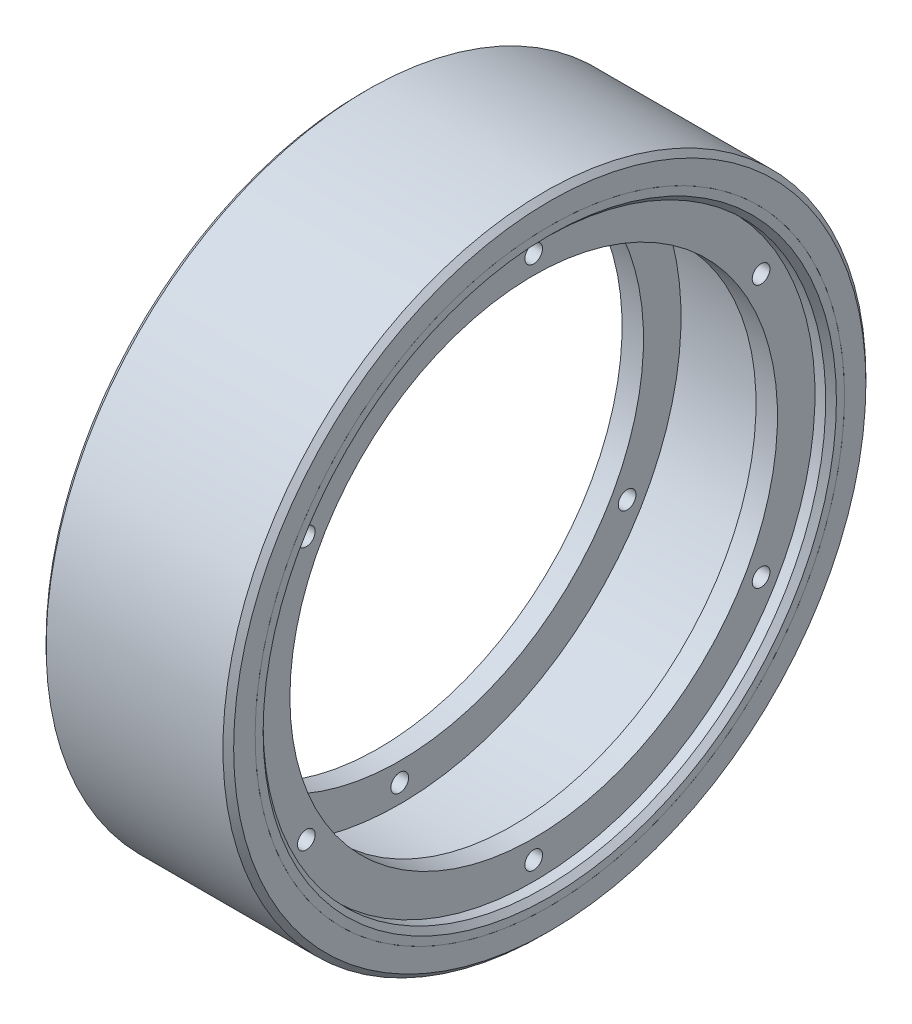
ISO-10303-21;
HEADER;
FILE_DESCRIPTION(('STEP AP214'),'2;1');
FILE_NAME('part.step','',(''),(''),'','','');
FILE_SCHEMA(('AUTOMOTIVE_DESIGN { 1 0 10303 214 1 1 1 1 }'));
ENDSEC;
DATA;
#1=APPLICATION_CONTEXT('core data for automotive mechanical design processes');
#2=APPLICATION_PROTOCOL_DEFINITION('international standard','automotive_design',2000,#1);
#3=PRODUCT_CONTEXT('',#1,'mechanical');
#4=PRODUCT('Part','Part','',(#3));
#5=PRODUCT_RELATED_PRODUCT_CATEGORY('part','',(#4));
#6=PRODUCT_DEFINITION_FORMATION('','',#4);
#7=PRODUCT_DEFINITION_CONTEXT('part definition',#1,'design');
#8=PRODUCT_DEFINITION('design','',#6,#7);
#9=PRODUCT_DEFINITION_SHAPE('','',#8);
#10=(LENGTH_UNIT() NAMED_UNIT(*) SI_UNIT(.MILLI.,.METRE.));
#11=(NAMED_UNIT(*) PLANE_ANGLE_UNIT() SI_UNIT($,.RADIAN.));
#12=(NAMED_UNIT(*) SI_UNIT($,.STERADIAN.) SOLID_ANGLE_UNIT());
#13=UNCERTAINTY_MEASURE_WITH_UNIT(LENGTH_MEASURE(1.E-05),#10,'distance_accuracy_value','');
#14=(GEOMETRIC_REPRESENTATION_CONTEXT(3) GLOBAL_UNCERTAINTY_ASSIGNED_CONTEXT((#13)) GLOBAL_UNIT_ASSIGNED_CONTEXT((#10,
#11,#12)) REPRESENTATION_CONTEXT('',''));
#15=CARTESIAN_POINT('',(0.,0.,0.));
#16=DIRECTION('',(0.,0.,1.));
#17=DIRECTION('',(1.,0.,0.));
#18=AXIS2_PLACEMENT_3D('',#15,#16,#17);
#19=CARTESIAN_POINT('',(17.5,52.5,0.));
#20=DIRECTION('',(-1.,0.,0.));
#21=DIRECTION('',(0.,0.,1.));
#22=AXIS2_PLACEMENT_3D('',#19,#20,#21);
#23=PLANE('',#22);
#24=CARTESIAN_POINT('',(17.5,0.,0.));
#25=DIRECTION('',(-1.,0.,0.));
#26=DIRECTION('',(0.,0.,1.));
#27=AXIS2_PLACEMENT_3D('',#24,#25,#26);
#28=CIRCLE('',#27,53.5);
#29=CARTESIAN_POINT('',(17.5,0.,53.5));
#30=VERTEX_POINT('',#29);
#31=EDGE_CURVE('E63',#30,#30,#28,.T.);
#32=ORIENTED_EDGE('',*,*,#31,.T.);
#33=EDGE_LOOP('',(#32));
#34=FACE_BOUND('',#33,.T.);
#35=CARTESIAN_POINT('',(17.5,0.,0.));
#36=DIRECTION('',(-1.,0.,0.));
#37=DIRECTION('',(0.,0.,1.));
#38=AXIS2_PLACEMENT_3D('',#35,#36,#37);
#39=CIRCLE('',#38,55.);
#40=CARTESIAN_POINT('',(17.5,0.,55.));
#41=VERTEX_POINT('',#40);
#42=EDGE_CURVE('E68',#41,#41,#39,.T.);
#43=ORIENTED_EDGE('',*,*,#42,.F.);
#44=EDGE_LOOP('',(#43));
#45=FACE_BOUND('',#44,.T.);
#46=ADVANCED_FACE('F47',(#34,#45),#23,.F.);
#47=CARTESIAN_POINT('',(0.,0.,0.));
#48=DIRECTION('',(-1.,0.,0.));
#49=DIRECTION('',(0.,0.,1.));
#50=AXIS2_PLACEMENT_3D('',#47,#48,#49);
#51=CYLINDRICAL_SURFACE('',#50,55.);
#52=CARTESIAN_POINT('',(-17.5,0.,0.));
#53=DIRECTION('',(-1.,0.,0.));
#54=DIRECTION('',(0.,0.,1.));
#55=AXIS2_PLACEMENT_3D('',#52,#53,#54);
#56=CIRCLE('',#55,55.);
#57=CARTESIAN_POINT('',(-17.5,0.,55.));
#58=VERTEX_POINT('',#57);
#59=EDGE_CURVE('E101',#58,#58,#56,.T.);
#60=ORIENTED_EDGE('',*,*,#59,.F.);
#61=EDGE_LOOP('',(#60));
#62=FACE_BOUND('',#61,.T.);
#63=ORIENTED_EDGE('',*,*,#42,.T.);
#64=EDGE_LOOP('',(#63));
#65=FACE_BOUND('',#64,.T.);
#66=ADVANCED_FACE('F200',(#62,#65),#51,.T.);
#67=CARTESIAN_POINT('',(-17.5,55.,0.));
#68=DIRECTION('',(1.,0.,0.));
#69=DIRECTION('',(0.,0.,-1.));
#70=AXIS2_PLACEMENT_3D('',#67,#68,#69);
#71=PLANE('',#70);
#72=CARTESIAN_POINT('',(-17.5,0.,0.));
#73=DIRECTION('',(1.,0.,0.));
#74=DIRECTION('',(0.,0.,-1.));
#75=AXIS2_PLACEMENT_3D('',#72,#73,#74);
#76=CIRCLE('',#75,53.5);
#77=CARTESIAN_POINT('',(-17.5,0.,-53.5));
#78=VERTEX_POINT('',#77);
#79=EDGE_CURVE('E11',#78,#78,#76,.T.);
#80=ORIENTED_EDGE('',*,*,#79,.T.);
#81=EDGE_LOOP('',(#80));
#82=FACE_BOUND('',#81,.T.);
#83=ORIENTED_EDGE('',*,*,#59,.T.);
#84=EDGE_LOOP('',(#83));
#85=FACE_BOUND('',#84,.T.);
#86=ADVANCED_FACE('F195',(#82,#85),#71,.F.);
#87=CARTESIAN_POINT('',(0.,0.,0.));
#88=DIRECTION('',(-1.,0.,0.));
#89=DIRECTION('',(0.,0.,1.));
#90=AXIS2_PLACEMENT_3D('',#87,#88,#89);
#91=CYLINDRICAL_SURFACE('',#90,52.5);
#92=CARTESIAN_POINT('',(-16.5,0.,0.));
#93=DIRECTION('',(1.,0.,0.));
#94=DIRECTION('',(0.,0.,-1.));
#95=AXIS2_PLACEMENT_3D('',#92,#93,#94);
#96=CIRCLE('',#95,52.5);
#97=CARTESIAN_POINT('',(-16.5,0.,-52.5));
#98=VERTEX_POINT('',#97);
#99=EDGE_CURVE('E55',#98,#98,#96,.F.);
#100=ORIENTED_EDGE('',*,*,#99,.T.);
#101=EDGE_LOOP('',(#100));
#102=FACE_BOUND('',#101,.T.);
#103=CARTESIAN_POINT('',(-14.5,0.,0.));
#104=DIRECTION('',(-1.,0.,0.));
#105=DIRECTION('',(0.,0.,1.));
#106=AXIS2_PLACEMENT_3D('',#103,#104,#105);
#107=CIRCLE('',#106,52.5);
#108=CARTESIAN_POINT('',(-14.5,0.,52.5));
#109=VERTEX_POINT('',#108);
#110=EDGE_CURVE('E104',#109,#109,#107,.T.);
#111=ORIENTED_EDGE('',*,*,#110,.F.);
#112=EDGE_LOOP('',(#111));
#113=FACE_BOUND('',#112,.T.);
#114=ADVANCED_FACE('F178',(#102,#113),#91,.F.);
#115=CARTESIAN_POINT('',(-14.5,52.5,0.));
#116=DIRECTION('',(1.,0.,0.));
#117=DIRECTION('',(0.,0.,-1.));
#118=AXIS2_PLACEMENT_3D('',#115,#116,#117);
#119=PLANE('',#118);
#120=CARTESIAN_POINT('',(-14.5,49.,0.));
#121=DIRECTION('',(-1.,0.,0.));
#122=DIRECTION('',(0.,0.,1.));
#123=AXIS2_PLACEMENT_3D('',#120,#121,#122);
#124=CIRCLE('',#123,1.64999999999999);
#125=CARTESIAN_POINT('',(-14.5,49.,1.64999999999999));
#126=VERTEX_POINT('',#125);
#127=EDGE_CURVE('E73',#126,#126,#124,.T.);
#128=ORIENTED_EDGE('',*,*,#127,.F.);
#129=EDGE_LOOP('',(#128));
#130=FACE_BOUND('',#129,.T.);
#131=CARTESIAN_POINT('',(-14.5,24.5,42.4352447854375));
#132=DIRECTION('',(-1.,0.,0.));
#133=DIRECTION('',(0.,0.,1.));
#134=AXIS2_PLACEMENT_3D('',#131,#132,#133);
#135=CIRCLE('',#134,1.64999999999999);
#136=CARTESIAN_POINT('',(-14.5,24.5,44.0852447854375));
#137=VERTEX_POINT('',#136);
#138=EDGE_CURVE('E78',#137,#137,#135,.T.);
#139=ORIENTED_EDGE('',*,*,#138,.F.);
#140=EDGE_LOOP('',(#139));
#141=FACE_BOUND('',#140,.T.);
#142=CARTESIAN_POINT('',(-14.5,-24.5,42.4352447854375));
#143=DIRECTION('',(-1.,0.,0.));
#144=DIRECTION('',(0.,0.,1.));
#145=AXIS2_PLACEMENT_3D('',#142,#143,#144);
#146=CIRCLE('',#145,1.64999999999999);
#147=CARTESIAN_POINT('',(-14.5,-24.5,44.0852447854375));
#148=VERTEX_POINT('',#147);
#149=EDGE_CURVE('E83',#148,#148,#146,.T.);
#150=ORIENTED_EDGE('',*,*,#149,.F.);
#151=EDGE_LOOP('',(#150));
#152=FACE_BOUND('',#151,.T.);
#153=CARTESIAN_POINT('',(-14.5,-49.,0.));
#154=DIRECTION('',(-1.,0.,0.));
#155=DIRECTION('',(0.,0.,1.));
#156=AXIS2_PLACEMENT_3D('',#153,#154,#155);
#157=CIRCLE('',#156,1.64999999999999);
#158=CARTESIAN_POINT('',(-14.5,-49.,1.65));
#159=VERTEX_POINT('',#158);
#160=EDGE_CURVE('E88',#159,#159,#157,.T.);
#161=ORIENTED_EDGE('',*,*,#160,.F.);
#162=EDGE_LOOP('',(#161));
#163=FACE_BOUND('',#162,.T.);
#164=CARTESIAN_POINT('',(-14.5,-24.5,-42.4352447854375));
#165=DIRECTION('',(-1.,0.,0.));
#166=DIRECTION('',(0.,0.,1.));
#167=AXIS2_PLACEMENT_3D('',#164,#165,#166);
#168=CIRCLE('',#167,1.64999999999999);
#169=CARTESIAN_POINT('',(-14.5,-24.5,-40.7852447854375));
#170=VERTEX_POINT('',#169);
#171=EDGE_CURVE('E93',#170,#170,#168,.T.);
#172=ORIENTED_EDGE('',*,*,#171,.F.);
#173=EDGE_LOOP('',(#172));
#174=FACE_BOUND('',#173,.T.);
#175=CARTESIAN_POINT('',(-14.5,24.5,-42.4352447854375));
#176=DIRECTION('',(-1.,0.,0.));
#177=DIRECTION('',(0.,0.,1.));
#178=AXIS2_PLACEMENT_3D('',#175,#176,#177);
#179=CIRCLE('',#178,1.64999999999999);
#180=CARTESIAN_POINT('',(-14.5,24.5,-40.7852447854375));
#181=VERTEX_POINT('',#180);
#182=EDGE_CURVE('E98',#181,#181,#179,.T.);
#183=ORIENTED_EDGE('',*,*,#182,.F.);
#184=EDGE_LOOP('',(#183));
#185=FACE_BOUND('',#184,.T.);
#186=CARTESIAN_POINT('',(-14.5,0.,0.));
#187=DIRECTION('',(-1.,0.,0.));
#188=DIRECTION('',(0.,0.,1.));
#189=AXIS2_PLACEMENT_3D('',#186,#187,#188);
#190=CIRCLE('',#189,45.5);
#191=CARTESIAN_POINT('',(-14.5,0.,45.5));
#192=VERTEX_POINT('',#191);
#193=EDGE_CURVE('E107',#192,#192,#190,.T.);
#194=ORIENTED_EDGE('',*,*,#193,.F.);
#195=EDGE_LOOP('',(#194));
#196=FACE_BOUND('',#195,.T.);
#197=ORIENTED_EDGE('',*,*,#110,.T.);
#198=EDGE_LOOP('',(#197));
#199=FACE_BOUND('',#198,.T.);
#200=ADVANCED_FACE('F174',(#130,#141,#152,#163,#174,#185,#196,#199),#119,.F.);
#201=CARTESIAN_POINT('',(0.,0.,0.));
#202=DIRECTION('',(-1.,0.,0.));
#203=DIRECTION('',(0.,0.,1.));
#204=AXIS2_PLACEMENT_3D('',#201,#202,#203);
#205=CYLINDRICAL_SURFACE('',#204,45.5);
#206=CARTESIAN_POINT('',(-10.5,0.,0.));
#207=DIRECTION('',(-1.,0.,0.));
#208=DIRECTION('',(0.,0.,1.));
#209=AXIS2_PLACEMENT_3D('',#206,#207,#208);
#210=CIRCLE('',#209,45.5);
#211=CARTESIAN_POINT('',(-10.5,0.,45.5));
#212=VERTEX_POINT('',#211);
#213=EDGE_CURVE('E110',#212,#212,#210,.T.);
#214=ORIENTED_EDGE('',*,*,#213,.F.);
#215=EDGE_LOOP('',(#214));
#216=FACE_BOUND('',#215,.T.);
#217=ORIENTED_EDGE('',*,*,#193,.T.);
#218=EDGE_LOOP('',(#217));
#219=FACE_BOUND('',#218,.T.);
#220=ADVANCED_FACE('F177',(#216,#219),#205,.F.);
#221=CARTESIAN_POINT('',(-10.5,45.5,0.));
#222=DIRECTION('',(-1.,0.,0.));
#223=DIRECTION('',(0.,0.,1.));
#224=AXIS2_PLACEMENT_3D('',#221,#222,#223);
#225=PLANE('',#224);
#226=CARTESIAN_POINT('',(-10.5,49.,0.));
#227=DIRECTION('',(-1.,0.,0.));
#228=DIRECTION('',(0.,0.,1.));
#229=AXIS2_PLACEMENT_3D('',#226,#227,#228);
#230=CIRCLE('',#229,1.64999999999999);
#231=CARTESIAN_POINT('',(-10.5,49.,1.64999999999999));
#232=VERTEX_POINT('',#231);
#233=EDGE_CURVE('E72',#232,#232,#230,.T.);
#234=ORIENTED_EDGE('',*,*,#233,.T.);
#235=EDGE_LOOP('',(#234));
#236=FACE_BOUND('',#235,.T.);
#237=CARTESIAN_POINT('',(-10.5,24.5,42.4352447854375));
#238=DIRECTION('',(-1.,0.,0.));
#239=DIRECTION('',(0.,0.,1.));
#240=AXIS2_PLACEMENT_3D('',#237,#238,#239);
#241=CIRCLE('',#240,1.64999999999999);
#242=CARTESIAN_POINT('',(-10.5,24.5,44.0852447854375));
#243=VERTEX_POINT('',#242);
#244=EDGE_CURVE('E156',#243,#243,#241,.T.);
#245=ORIENTED_EDGE('',*,*,#244,.T.);
#246=EDGE_LOOP('',(#245));
#247=FACE_BOUND('',#246,.T.);
#248=CARTESIAN_POINT('',(-10.5,-24.5,42.4352447854375));
#249=DIRECTION('',(-1.,0.,0.));
#250=DIRECTION('',(0.,0.,1.));
#251=AXIS2_PLACEMENT_3D('',#248,#249,#250);
#252=CIRCLE('',#251,1.64999999999999);
#253=CARTESIAN_POINT('',(-10.5,-24.5,44.0852447854375));
#254=VERTEX_POINT('',#253);
#255=EDGE_CURVE('E149',#254,#254,#252,.T.);
#256=ORIENTED_EDGE('',*,*,#255,.T.);
#257=EDGE_LOOP('',(#256));
#258=FACE_BOUND('',#257,.T.);
#259=CARTESIAN_POINT('',(-10.5,-49.,0.));
#260=DIRECTION('',(-1.,0.,0.));
#261=DIRECTION('',(0.,0.,1.));
#262=AXIS2_PLACEMENT_3D('',#259,#260,#261);
#263=CIRCLE('',#262,1.64999999999999);
#264=CARTESIAN_POINT('',(-10.5,-49.,1.65));
#265=VERTEX_POINT('',#264);
#266=EDGE_CURVE('E142',#265,#265,#263,.T.);
#267=ORIENTED_EDGE('',*,*,#266,.T.);
#268=EDGE_LOOP('',(#267));
#269=FACE_BOUND('',#268,.T.);
#270=CARTESIAN_POINT('',(-10.5,-24.5,-42.4352447854375));
#271=DIRECTION('',(-1.,0.,0.));
#272=DIRECTION('',(0.,0.,1.));
#273=AXIS2_PLACEMENT_3D('',#270,#271,#272);
#274=CIRCLE('',#273,1.64999999999999);
#275=CARTESIAN_POINT('',(-10.5,-24.5,-40.7852447854375));
#276=VERTEX_POINT('',#275);
#277=EDGE_CURVE('E135',#276,#276,#274,.T.);
#278=ORIENTED_EDGE('',*,*,#277,.T.);
#279=EDGE_LOOP('',(#278));
#280=FACE_BOUND('',#279,.T.);
#281=CARTESIAN_POINT('',(-10.5,24.5,-42.4352447854375));
#282=DIRECTION('',(-1.,0.,0.));
#283=DIRECTION('',(0.,0.,1.));
#284=AXIS2_PLACEMENT_3D('',#281,#282,#283);
#285=CIRCLE('',#284,1.64999999999999);
#286=CARTESIAN_POINT('',(-10.5,24.5,-40.7852447854375));
#287=VERTEX_POINT('',#286);
#288=EDGE_CURVE('E128',#287,#287,#285,.T.);
#289=ORIENTED_EDGE('',*,*,#288,.T.);
#290=EDGE_LOOP('',(#289));
#291=FACE_BOUND('',#290,.T.);
#292=CARTESIAN_POINT('',(-10.5,0.,0.));
#293=DIRECTION('',(-1.,0.,0.));
#294=DIRECTION('',(0.,0.,1.));
#295=AXIS2_PLACEMENT_3D('',#292,#293,#294);
#296=CIRCLE('',#295,52.5);
#297=CARTESIAN_POINT('',(-10.5,0.,52.5));
#298=VERTEX_POINT('',#297);
#299=EDGE_CURVE('E113',#298,#298,#296,.T.);
#300=ORIENTED_EDGE('',*,*,#299,.F.);
#301=EDGE_LOOP('',(#300));
#302=FACE_BOUND('',#301,.T.);
#303=ORIENTED_EDGE('',*,*,#213,.T.);
#304=EDGE_LOOP('',(#303));
#305=FACE_BOUND('',#304,.T.);
#306=ADVANCED_FACE('F258',(#236,#247,#258,#269,#280,#291,#302,#305),#225,.F.);
#307=CARTESIAN_POINT('',(0.,0.,0.));
#308=DIRECTION('',(-1.,0.,0.));
#309=DIRECTION('',(0.,0.,1.));
#310=AXIS2_PLACEMENT_3D('',#307,#308,#309);
#311=CYLINDRICAL_SURFACE('',#310,52.5);
#312=CARTESIAN_POINT('',(10.5,0.,0.));
#313=DIRECTION('',(-1.,0.,0.));
#314=DIRECTION('',(0.,0.,1.));
#315=AXIS2_PLACEMENT_3D('',#312,#313,#314);
#316=CIRCLE('',#315,52.5);
#317=CARTESIAN_POINT('',(10.5,0.,52.5));
#318=VERTEX_POINT('',#317);
#319=EDGE_CURVE('E116',#318,#318,#316,.T.);
#320=ORIENTED_EDGE('',*,*,#319,.F.);
#321=EDGE_LOOP('',(#320));
#322=FACE_BOUND('',#321,.T.);
#323=ORIENTED_EDGE('',*,*,#299,.T.);
#324=EDGE_LOOP('',(#323));
#325=FACE_BOUND('',#324,.T.);
#326=ADVANCED_FACE('F251',(#322,#325),#311,.F.);
#327=CARTESIAN_POINT('',(10.5,45.5,0.));
#328=DIRECTION('',(1.,0.,0.));
#329=DIRECTION('',(0.,0.,-1.));
#330=AXIS2_PLACEMENT_3D('',#327,#328,#329);
#331=PLANE('',#330);
#332=CARTESIAN_POINT('',(10.5,49.,0.));
#333=DIRECTION('',(1.,0.,0.));
#334=DIRECTION('',(0.,0.,-1.));
#335=AXIS2_PLACEMENT_3D('',#332,#333,#334);
#336=CIRCLE('',#335,1.64999999999999);
#337=CARTESIAN_POINT('',(10.5,49.,-1.64999999999999));
#338=VERTEX_POINT('',#337);
#339=EDGE_CURVE('E163',#338,#338,#336,.T.);
#340=ORIENTED_EDGE('',*,*,#339,.T.);
#341=EDGE_LOOP('',(#340));
#342=FACE_BOUND('',#341,.T.);
#343=CARTESIAN_POINT('',(10.5,24.5,42.4352447854375));
#344=DIRECTION('',(1.,0.,0.));
#345=DIRECTION('',(0.,0.,-1.));
#346=AXIS2_PLACEMENT_3D('',#343,#344,#345);
#347=CIRCLE('',#346,1.64999999999999);
#348=CARTESIAN_POINT('',(10.5,24.5,40.7852447854375));
#349=VERTEX_POINT('',#348);
#350=EDGE_CURVE('E74',#349,#349,#347,.T.);
#351=ORIENTED_EDGE('',*,*,#350,.T.);
#352=EDGE_LOOP('',(#351));
#353=FACE_BOUND('',#352,.T.);
#354=CARTESIAN_POINT('',(10.5,-24.5,42.4352447854375));
#355=DIRECTION('',(1.,0.,0.));
#356=DIRECTION('',(0.,0.,-1.));
#357=AXIS2_PLACEMENT_3D('',#354,#355,#356);
#358=CIRCLE('',#357,1.64999999999999);
#359=CARTESIAN_POINT('',(10.5,-24.5,40.7852447854375));
#360=VERTEX_POINT('',#359);
#361=EDGE_CURVE('E79',#360,#360,#358,.T.);
#362=ORIENTED_EDGE('',*,*,#361,.T.);
#363=EDGE_LOOP('',(#362));
#364=FACE_BOUND('',#363,.T.);
#365=CARTESIAN_POINT('',(10.5,-49.,0.));
#366=DIRECTION('',(1.,0.,0.));
#367=DIRECTION('',(0.,0.,-1.));
#368=AXIS2_PLACEMENT_3D('',#365,#366,#367);
#369=CIRCLE('',#368,1.64999999999999);
#370=CARTESIAN_POINT('',(10.5,-49.,-1.64999999999999));
#371=VERTEX_POINT('',#370);
#372=EDGE_CURVE('E87',#371,#371,#369,.T.);
#373=ORIENTED_EDGE('',*,*,#372,.T.);
#374=EDGE_LOOP('',(#373));
#375=FACE_BOUND('',#374,.T.);
#376=CARTESIAN_POINT('',(10.5,-24.5,-42.4352447854375));
#377=DIRECTION('',(1.,0.,0.));
#378=DIRECTION('',(0.,0.,-1.));
#379=AXIS2_PLACEMENT_3D('',#376,#377,#378);
#380=CIRCLE('',#379,1.64999999999999);
#381=CARTESIAN_POINT('',(10.5,-24.5,-44.0852447854375));
#382=VERTEX_POINT('',#381);
#383=EDGE_CURVE('E92',#382,#382,#380,.T.);
#384=ORIENTED_EDGE('',*,*,#383,.T.);
#385=EDGE_LOOP('',(#384));
#386=FACE_BOUND('',#385,.T.);
#387=CARTESIAN_POINT('',(10.5,24.5,-42.4352447854375));
#388=DIRECTION('',(1.,0.,0.));
#389=DIRECTION('',(0.,0.,-1.));
#390=AXIS2_PLACEMENT_3D('',#387,#388,#389);
#391=CIRCLE('',#390,1.64999999999999);
#392=CARTESIAN_POINT('',(10.5,24.5,-44.0852447854375));
#393=VERTEX_POINT('',#392);
#394=EDGE_CURVE('E94',#393,#393,#391,.T.);
#395=ORIENTED_EDGE('',*,*,#394,.T.);
#396=EDGE_LOOP('',(#395));
#397=FACE_BOUND('',#396,.T.);
#398=CARTESIAN_POINT('',(10.5,0.,0.));
#399=DIRECTION('',(-1.,0.,0.));
#400=DIRECTION('',(0.,0.,1.));
#401=AXIS2_PLACEMENT_3D('',#398,#399,#400);
#402=CIRCLE('',#401,45.5);
#403=CARTESIAN_POINT('',(10.5,0.,45.5));
#404=VERTEX_POINT('',#403);
#405=EDGE_CURVE('E119',#404,#404,#402,.T.);
#406=ORIENTED_EDGE('',*,*,#405,.F.);
#407=EDGE_LOOP('',(#406));
#408=FACE_BOUND('',#407,.T.);
#409=ORIENTED_EDGE('',*,*,#319,.T.);
#410=EDGE_LOOP('',(#409));
#411=FACE_BOUND('',#410,.T.);
#412=ADVANCED_FACE('F245',(#342,#353,#364,#375,#386,#397,#408,#411),#331,.F.);
#413=CARTESIAN_POINT('',(0.,0.,0.));
#414=DIRECTION('',(-1.,0.,0.));
#415=DIRECTION('',(0.,0.,1.));
#416=AXIS2_PLACEMENT_3D('',#413,#414,#415);
#417=CYLINDRICAL_SURFACE('',#416,45.5);
#418=CARTESIAN_POINT('',(14.5,0.,0.));
#419=DIRECTION('',(-1.,0.,0.));
#420=DIRECTION('',(0.,0.,1.));
#421=AXIS2_PLACEMENT_3D('',#418,#419,#420);
#422=CIRCLE('',#421,45.5);
#423=CARTESIAN_POINT('',(14.5,0.,45.5));
#424=VERTEX_POINT('',#423);
#425=EDGE_CURVE('E122',#424,#424,#422,.T.);
#426=ORIENTED_EDGE('',*,*,#425,.F.);
#427=EDGE_LOOP('',(#426));
#428=FACE_BOUND('',#427,.T.);
#429=ORIENTED_EDGE('',*,*,#405,.T.);
#430=EDGE_LOOP('',(#429));
#431=FACE_BOUND('',#430,.T.);
#432=ADVANCED_FACE('F238',(#428,#431),#417,.F.);
#433=CARTESIAN_POINT('',(14.5,45.5,0.));
#434=DIRECTION('',(-1.,0.,0.));
#435=DIRECTION('',(0.,0.,1.));
#436=AXIS2_PLACEMENT_3D('',#433,#434,#435);
#437=PLANE('',#436);
#438=CARTESIAN_POINT('',(14.5,49.,0.));
#439=DIRECTION('',(-1.,0.,0.));
#440=DIRECTION('',(0.,0.,1.));
#441=AXIS2_PLACEMENT_3D('',#438,#439,#440);
#442=CIRCLE('',#441,1.64999999999999);
#443=CARTESIAN_POINT('',(14.5,49.,1.64999999999999));
#444=VERTEX_POINT('',#443);
#445=EDGE_CURVE('E69',#444,#444,#442,.T.);
#446=ORIENTED_EDGE('',*,*,#445,.T.);
#447=EDGE_LOOP('',(#446));
#448=FACE_BOUND('',#447,.T.);
#449=CARTESIAN_POINT('',(14.5,24.5,42.4352447854375));
#450=DIRECTION('',(-1.,0.,0.));
#451=DIRECTION('',(0.,0.,1.));
#452=AXIS2_PLACEMENT_3D('',#449,#450,#451);
#453=CIRCLE('',#452,1.64999999999999);
#454=CARTESIAN_POINT('',(14.5,24.5,44.0852447854375));
#455=VERTEX_POINT('',#454);
#456=EDGE_CURVE('E77',#455,#455,#453,.T.);
#457=ORIENTED_EDGE('',*,*,#456,.T.);
#458=EDGE_LOOP('',(#457));
#459=FACE_BOUND('',#458,.T.);
#460=CARTESIAN_POINT('',(14.5,-24.5,42.4352447854375));
#461=DIRECTION('',(-1.,0.,0.));
#462=DIRECTION('',(0.,0.,1.));
#463=AXIS2_PLACEMENT_3D('',#460,#461,#462);
#464=CIRCLE('',#463,1.64999999999999);
#465=CARTESIAN_POINT('',(14.5,-24.5,44.0852447854375));
#466=VERTEX_POINT('',#465);
#467=EDGE_CURVE('E82',#466,#466,#464,.T.);
#468=ORIENTED_EDGE('',*,*,#467,.T.);
#469=EDGE_LOOP('',(#468));
#470=FACE_BOUND('',#469,.T.);
#471=CARTESIAN_POINT('',(14.5,-49.,0.));
#472=DIRECTION('',(-1.,0.,0.));
#473=DIRECTION('',(0.,0.,1.));
#474=AXIS2_PLACEMENT_3D('',#471,#472,#473);
#475=CIRCLE('',#474,1.64999999999999);
#476=CARTESIAN_POINT('',(14.5,-49.,1.65));
#477=VERTEX_POINT('',#476);
#478=EDGE_CURVE('E84',#477,#477,#475,.T.);
#479=ORIENTED_EDGE('',*,*,#478,.T.);
#480=EDGE_LOOP('',(#479));
#481=FACE_BOUND('',#480,.T.);
#482=CARTESIAN_POINT('',(14.5,-24.5,-42.4352447854375));
#483=DIRECTION('',(-1.,0.,0.));
#484=DIRECTION('',(0.,0.,1.));
#485=AXIS2_PLACEMENT_3D('',#482,#483,#484);
#486=CIRCLE('',#485,1.64999999999999);
#487=CARTESIAN_POINT('',(14.5,-24.5,-40.7852447854375));
#488=VERTEX_POINT('',#487);
#489=EDGE_CURVE('E89',#488,#488,#486,.T.);
#490=ORIENTED_EDGE('',*,*,#489,.T.);
#491=EDGE_LOOP('',(#490));
#492=FACE_BOUND('',#491,.T.);
#493=CARTESIAN_POINT('',(14.5,24.5,-42.4352447854375));
#494=DIRECTION('',(-1.,0.,0.));
#495=DIRECTION('',(0.,0.,1.));
#496=AXIS2_PLACEMENT_3D('',#493,#494,#495);
#497=CIRCLE('',#496,1.64999999999999);
#498=CARTESIAN_POINT('',(14.5,24.5,-40.7852447854375));
#499=VERTEX_POINT('',#498);
#500=EDGE_CURVE('E97',#499,#499,#497,.T.);
#501=ORIENTED_EDGE('',*,*,#500,.T.);
#502=EDGE_LOOP('',(#501));
#503=FACE_BOUND('',#502,.T.);
#504=CARTESIAN_POINT('',(14.5,0.,0.));
#505=DIRECTION('',(-1.,0.,0.));
#506=DIRECTION('',(0.,0.,1.));
#507=AXIS2_PLACEMENT_3D('',#504,#505,#506);
#508=CIRCLE('',#507,52.5);
#509=CARTESIAN_POINT('',(14.5,0.,52.5));
#510=VERTEX_POINT('',#509);
#511=EDGE_CURVE('E125',#510,#510,#508,.T.);
#512=ORIENTED_EDGE('',*,*,#511,.F.);
#513=EDGE_LOOP('',(#512));
#514=FACE_BOUND('',#513,.T.);
#515=ORIENTED_EDGE('',*,*,#425,.T.);
#516=EDGE_LOOP('',(#515));
#517=FACE_BOUND('',#516,.T.);
#518=ADVANCED_FACE('F232',(#448,#459,#470,#481,#492,#503,#514,#517),#437,.F.);
#519=CARTESIAN_POINT('',(0.,0.,0.));
#520=DIRECTION('',(-1.,0.,0.));
#521=DIRECTION('',(0.,0.,1.));
#522=AXIS2_PLACEMENT_3D('',#519,#520,#521);
#523=CYLINDRICAL_SURFACE('',#522,52.5);
#524=CARTESIAN_POINT('',(16.5,0.,0.));
#525=DIRECTION('',(-1.,0.,0.));
#526=DIRECTION('',(0.,0.,1.));
#527=AXIS2_PLACEMENT_3D('',#524,#525,#526);
#528=CIRCLE('',#527,52.5);
#529=CARTESIAN_POINT('',(16.5,0.,52.5));
#530=VERTEX_POINT('',#529);
#531=EDGE_CURVE('E59',#530,#530,#528,.F.);
#532=ORIENTED_EDGE('',*,*,#531,.T.);
#533=EDGE_LOOP('',(#532));
#534=FACE_BOUND('',#533,.T.);
#535=ORIENTED_EDGE('',*,*,#511,.T.);
#536=EDGE_LOOP('',(#535));
#537=FACE_BOUND('',#536,.T.);
#538=ADVANCED_FACE('F228',(#534,#537),#523,.F.);
#539=CARTESIAN_POINT('',(-14.5,24.5,-42.4352447854375));
#540=DIRECTION('',(-1.,0.,0.));
#541=DIRECTION('',(0.,0.,1.));
#542=AXIS2_PLACEMENT_3D('',#539,#540,#541);
#543=CYLINDRICAL_SURFACE('',#542,1.64999999999999);
#544=ORIENTED_EDGE('',*,*,#394,.F.);
#545=EDGE_LOOP('',(#544));
#546=FACE_BOUND('',#545,.T.);
#547=ORIENTED_EDGE('',*,*,#500,.F.);
#548=EDGE_LOOP('',(#547));
#549=FACE_BOUND('',#548,.T.);
#550=ADVANCED_FACE('F231',(#546,#549),#543,.F.);
#551=ORIENTED_EDGE('',*,*,#182,.T.);
#552=EDGE_LOOP('',(#551));
#553=FACE_BOUND('',#552,.T.);
#554=ORIENTED_EDGE('',*,*,#288,.F.);
#555=EDGE_LOOP('',(#554));
#556=FACE_BOUND('',#555,.T.);
#557=ADVANCED_FACE('F274',(#553,#556),#543,.F.);
#558=CARTESIAN_POINT('',(-14.5,-24.5,-42.4352447854375));
#559=DIRECTION('',(-1.,0.,0.));
#560=DIRECTION('',(0.,0.,1.));
#561=AXIS2_PLACEMENT_3D('',#558,#559,#560);
#562=CYLINDRICAL_SURFACE('',#561,1.64999999999999);
#563=ORIENTED_EDGE('',*,*,#489,.F.);
#564=EDGE_LOOP('',(#563));
#565=FACE_BOUND('',#564,.T.);
#566=ORIENTED_EDGE('',*,*,#383,.F.);
#567=EDGE_LOOP('',(#566));
#568=FACE_BOUND('',#567,.T.);
#569=ADVANCED_FACE('F277',(#565,#568),#562,.F.);
#570=ORIENTED_EDGE('',*,*,#171,.T.);
#571=EDGE_LOOP('',(#570));
#572=FACE_BOUND('',#571,.T.);
#573=ORIENTED_EDGE('',*,*,#277,.F.);
#574=EDGE_LOOP('',(#573));
#575=FACE_BOUND('',#574,.T.);
#576=ADVANCED_FACE('F279',(#572,#575),#562,.F.);
#577=CARTESIAN_POINT('',(-14.5,-49.,0.));
#578=DIRECTION('',(-1.,0.,0.));
#579=DIRECTION('',(0.,0.,1.));
#580=AXIS2_PLACEMENT_3D('',#577,#578,#579);
#581=CYLINDRICAL_SURFACE('',#580,1.64999999999999);
#582=ORIENTED_EDGE('',*,*,#478,.F.);
#583=EDGE_LOOP('',(#582));
#584=FACE_BOUND('',#583,.T.);
#585=ORIENTED_EDGE('',*,*,#372,.F.);
#586=EDGE_LOOP('',(#585));
#587=FACE_BOUND('',#586,.T.);
#588=ADVANCED_FACE('F282',(#584,#587),#581,.F.);
#589=ORIENTED_EDGE('',*,*,#160,.T.);
#590=EDGE_LOOP('',(#589));
#591=FACE_BOUND('',#590,.T.);
#592=ORIENTED_EDGE('',*,*,#266,.F.);
#593=EDGE_LOOP('',(#592));
#594=FACE_BOUND('',#593,.T.);
#595=ADVANCED_FACE('F284',(#591,#594),#581,.F.);
#596=CARTESIAN_POINT('',(-14.5,-24.5,42.4352447854375));
#597=DIRECTION('',(-1.,0.,0.));
#598=DIRECTION('',(0.,0.,1.));
#599=AXIS2_PLACEMENT_3D('',#596,#597,#598);
#600=CYLINDRICAL_SURFACE('',#599,1.64999999999999);
#601=ORIENTED_EDGE('',*,*,#361,.F.);
#602=EDGE_LOOP('',(#601));
#603=FACE_BOUND('',#602,.T.);
#604=ORIENTED_EDGE('',*,*,#467,.F.);
#605=EDGE_LOOP('',(#604));
#606=FACE_BOUND('',#605,.T.);
#607=ADVANCED_FACE('F287',(#603,#606),#600,.F.);
#608=ORIENTED_EDGE('',*,*,#149,.T.);
#609=EDGE_LOOP('',(#608));
#610=FACE_BOUND('',#609,.T.);
#611=ORIENTED_EDGE('',*,*,#255,.F.);
#612=EDGE_LOOP('',(#611));
#613=FACE_BOUND('',#612,.T.);
#614=ADVANCED_FACE('F289',(#610,#613),#600,.F.);
#615=CARTESIAN_POINT('',(-14.5,24.5,42.4352447854375));
#616=DIRECTION('',(-1.,0.,0.));
#617=DIRECTION('',(0.,0.,1.));
#618=AXIS2_PLACEMENT_3D('',#615,#616,#617);
#619=CYLINDRICAL_SURFACE('',#618,1.64999999999999);
#620=ORIENTED_EDGE('',*,*,#350,.F.);
#621=EDGE_LOOP('',(#620));
#622=FACE_BOUND('',#621,.T.);
#623=ORIENTED_EDGE('',*,*,#456,.F.);
#624=EDGE_LOOP('',(#623));
#625=FACE_BOUND('',#624,.T.);
#626=ADVANCED_FACE('F292',(#622,#625),#619,.F.);
#627=ORIENTED_EDGE('',*,*,#138,.T.);
#628=EDGE_LOOP('',(#627));
#629=FACE_BOUND('',#628,.T.);
#630=ORIENTED_EDGE('',*,*,#244,.F.);
#631=EDGE_LOOP('',(#630));
#632=FACE_BOUND('',#631,.T.);
#633=ADVANCED_FACE('F294',(#629,#632),#619,.F.);
#634=CARTESIAN_POINT('',(-14.5,49.,0.));
#635=DIRECTION('',(-1.,0.,0.));
#636=DIRECTION('',(0.,0.,1.));
#637=AXIS2_PLACEMENT_3D('',#634,#635,#636);
#638=CYLINDRICAL_SURFACE('',#637,1.64999999999999);
#639=ORIENTED_EDGE('',*,*,#445,.F.);
#640=EDGE_LOOP('',(#639));
#641=FACE_BOUND('',#640,.T.);
#642=ORIENTED_EDGE('',*,*,#339,.F.);
#643=EDGE_LOOP('',(#642));
#644=FACE_BOUND('',#643,.T.);
#645=ADVANCED_FACE('F222',(#641,#644),#638,.F.);
#646=ORIENTED_EDGE('',*,*,#127,.T.);
#647=EDGE_LOOP('',(#646));
#648=FACE_BOUND('',#647,.T.);
#649=ORIENTED_EDGE('',*,*,#233,.F.);
#650=EDGE_LOOP('',(#649));
#651=FACE_BOUND('',#650,.T.);
#652=ADVANCED_FACE('F171',(#648,#651),#638,.F.);
#653=CARTESIAN_POINT('',(17.5,0.,0.));
#654=DIRECTION('',(1.,0.,0.));
#655=DIRECTION('',(0.,0.,-1.));
#656=AXIS2_PLACEMENT_3D('',#653,#654,#655);
#657=CONICAL_SURFACE('',#656,53.5,0.785398163397441);
#658=ORIENTED_EDGE('',*,*,#531,.F.);
#659=EDGE_LOOP('',(#658));
#660=FACE_BOUND('',#659,.T.);
#661=ORIENTED_EDGE('',*,*,#31,.F.);
#662=EDGE_LOOP('',(#661));
#663=FACE_BOUND('',#662,.T.);
#664=ADVANCED_FACE('F212',(#660,#663),#657,.F.);
#665=CARTESIAN_POINT('',(-16.5,0.,0.));
#666=DIRECTION('',(-1.,0.,0.));
#667=DIRECTION('',(0.,0.,1.));
#668=AXIS2_PLACEMENT_3D('',#665,#666,#667);
#669=CONICAL_SURFACE('',#668,52.5,0.785398163397455);
#670=ORIENTED_EDGE('',*,*,#79,.F.);
#671=EDGE_LOOP('',(#670));
#672=FACE_BOUND('',#671,.T.);
#673=ORIENTED_EDGE('',*,*,#99,.F.);
#674=EDGE_LOOP('',(#673));
#675=FACE_BOUND('',#674,.T.);
#676=ADVANCED_FACE('F50',(#672,#675),#669,.F.);
#677=CLOSED_SHELL('',(#46,#66,#86,#114,#200,#220,#306,#326,#412,#432,#518,#538,#550,#557,#569,
#576,#588,#595,#607,#614,#626,#633,#645,#652,#664,#676));
#678=MANIFOLD_SOLID_BREP('B2',#677);
#679=CARTESIAN_POINT('',(17.5,0.,0.));
#680=DIRECTION('',(1.,0.,0.));
#681=DIRECTION('',(0.,0.,-1.));
#682=AXIS2_PLACEMENT_3D('',#679,#680,#681);
#683=PLANE('',#682);
#684=CARTESIAN_POINT('',(17.5,0.,0.));
#685=DIRECTION('',(1.,0.,0.));
#686=DIRECTION('',(0.,0.,-1.));
#687=AXIS2_PLACEMENT_3D('',#684,#685,#686);
#688=CIRCLE('',#687,59.);
#689=CARTESIAN_POINT('',(17.5,0.,-59.));
#690=VERTEX_POINT('',#689);
#691=EDGE_CURVE('E599',#690,#690,#688,.T.);
#692=ORIENTED_EDGE('',*,*,#691,.T.);
#693=EDGE_LOOP('',(#692));
#694=FACE_BOUND('',#693,.T.);
#695=CARTESIAN_POINT('',(17.5,0.,0.));
#696=DIRECTION('',(1.,0.,0.));
#697=DIRECTION('',(0.,0.,-1.));
#698=AXIS2_PLACEMENT_3D('',#695,#696,#697);
#699=CIRCLE('',#698,55.);
#700=CARTESIAN_POINT('',(17.5,0.,-55.));
#701=VERTEX_POINT('',#700);
#702=EDGE_CURVE('E604',#701,#701,#699,.T.);
#703=ORIENTED_EDGE('',*,*,#702,.F.);
#704=EDGE_LOOP('',(#703));
#705=FACE_BOUND('',#704,.T.);
#706=ADVANCED_FACE('F583',(#694,#705),#683,.T.);
#707=CARTESIAN_POINT('',(-17.5,0.,0.));
#708=DIRECTION('',(1.,0.,0.));
#709=DIRECTION('',(0.,0.,-1.));
#710=AXIS2_PLACEMENT_3D('',#707,#708,#709);
#711=PLANE('',#710);
#712=CARTESIAN_POINT('',(-17.5,0.,0.));
#713=DIRECTION('',(1.,0.,0.));
#714=DIRECTION('',(0.,0.,-1.));
#715=AXIS2_PLACEMENT_3D('',#712,#713,#714);
#716=CIRCLE('',#715,59.);
#717=CARTESIAN_POINT('',(-17.5,0.,-59.));
#718=VERTEX_POINT('',#717);
#719=EDGE_CURVE('E46',#718,#718,#716,.F.);
#720=ORIENTED_EDGE('',*,*,#719,.T.);
#721=EDGE_LOOP('',(#720));
#722=FACE_BOUND('',#721,.T.);
#723=CARTESIAN_POINT('',(-17.5,0.,0.));
#724=DIRECTION('',(1.,0.,0.));
#725=DIRECTION('',(0.,0.,-1.));
#726=AXIS2_PLACEMENT_3D('',#723,#724,#725);
#727=CIRCLE('',#726,55.);
#728=CARTESIAN_POINT('',(-17.5,0.,-55.));
#729=VERTEX_POINT('',#728);
#730=EDGE_CURVE('E605',#729,#729,#727,.T.);
#731=ORIENTED_EDGE('',*,*,#730,.T.);
#732=EDGE_LOOP('',(#731));
#733=FACE_BOUND('',#732,.T.);
#734=ADVANCED_FACE('F615',(#722,#733),#711,.F.);
#735=CARTESIAN_POINT('',(17.5,0.,0.));
#736=DIRECTION('',(-1.,0.,0.));
#737=DIRECTION('',(0.,0.,1.));
#738=AXIS2_PLACEMENT_3D('',#735,#736,#737);
#739=CYLINDRICAL_SURFACE('',#738,60.);
#740=CARTESIAN_POINT('',(16.5,0.,0.));
#741=DIRECTION('',(1.,0.,0.));
#742=DIRECTION('',(0.,0.,-1.));
#743=AXIS2_PLACEMENT_3D('',#740,#741,#742);
#744=CIRCLE('',#743,60.);
#745=CARTESIAN_POINT('',(16.5,0.,-60.));
#746=VERTEX_POINT('',#745);
#747=EDGE_CURVE('E591',#746,#746,#744,.F.);
#748=ORIENTED_EDGE('',*,*,#747,.T.);
#749=EDGE_LOOP('',(#748));
#750=FACE_BOUND('',#749,.T.);
#751=CARTESIAN_POINT('',(-16.5,0.,0.));
#752=DIRECTION('',(1.,0.,0.));
#753=DIRECTION('',(0.,0.,-1.));
#754=AXIS2_PLACEMENT_3D('',#751,#752,#753);
#755=CIRCLE('',#754,60.);
#756=CARTESIAN_POINT('',(-16.5,0.,-60.));
#757=VERTEX_POINT('',#756);
#758=EDGE_CURVE('E595',#757,#757,#755,.T.);
#759=ORIENTED_EDGE('',*,*,#758,.T.);
#760=EDGE_LOOP('',(#759));
#761=FACE_BOUND('',#760,.T.);
#762=ADVANCED_FACE('F621',(#750,#761),#739,.T.);
#763=CARTESIAN_POINT('',(17.5,0.,0.));
#764=DIRECTION('',(-1.,0.,0.));
#765=DIRECTION('',(0.,0.,1.));
#766=AXIS2_PLACEMENT_3D('',#763,#764,#765);
#767=CYLINDRICAL_SURFACE('',#766,55.);
#768=ORIENTED_EDGE('',*,*,#702,.T.);
#769=EDGE_LOOP('',(#768));
#770=FACE_BOUND('',#769,.T.);
#771=ORIENTED_EDGE('',*,*,#730,.F.);
#772=EDGE_LOOP('',(#771));
#773=FACE_BOUND('',#772,.T.);
#774=ADVANCED_FACE('F611',(#770,#773),#767,.F.);
#775=CARTESIAN_POINT('',(17.5,0.,0.));
#776=DIRECTION('',(-1.,0.,0.));
#777=DIRECTION('',(0.,0.,1.));
#778=AXIS2_PLACEMENT_3D('',#775,#776,#777);
#779=CONICAL_SURFACE('',#778,59.,0.785398163397452);
#780=ORIENTED_EDGE('',*,*,#747,.F.);
#781=EDGE_LOOP('',(#780));
#782=FACE_BOUND('',#781,.T.);
#783=ORIENTED_EDGE('',*,*,#691,.F.);
#784=EDGE_LOOP('',(#783));
#785=FACE_BOUND('',#784,.T.);
#786=ADVANCED_FACE('F627',(#782,#785),#779,.T.);
#787=CARTESIAN_POINT('',(-16.5,0.,0.));
#788=DIRECTION('',(1.,0.,0.));
#789=DIRECTION('',(0.,0.,-1.));
#790=AXIS2_PLACEMENT_3D('',#787,#788,#789);
#791=CONICAL_SURFACE('',#790,60.,0.785398163397445);
#792=ORIENTED_EDGE('',*,*,#719,.F.);
#793=EDGE_LOOP('',(#792));
#794=FACE_BOUND('',#793,.T.);
#795=ORIENTED_EDGE('',*,*,#758,.F.);
#796=EDGE_LOOP('',(#795));
#797=FACE_BOUND('',#796,.T.);
#798=ADVANCED_FACE('F586',(#794,#797),#791,.T.);
#799=CLOSED_SHELL('',(#706,#734,#762,#774,#786,#798));
#800=MANIFOLD_SOLID_BREP('B6',#799);
#801=ADVANCED_BREP_SHAPE_REPRESENTATION('',(#18,#678,#800),#14);
#802=SHAPE_DEFINITION_REPRESENTATION(#9,#801);
ENDSEC;
END-ISO-10303-21;
